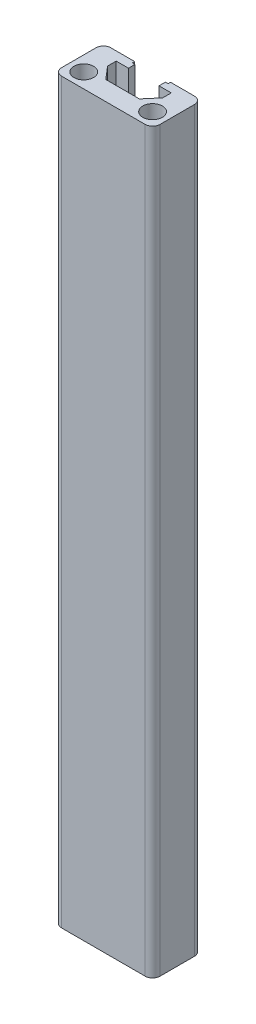
ISO-10303-21;
HEADER;
FILE_DESCRIPTION(('STEP AP214'),'2;1');
FILE_NAME('part.step','',(''),(''),'','','');
FILE_SCHEMA(('AUTOMOTIVE_DESIGN { 1 0 10303 214 1 1 1 1 }'));
ENDSEC;
DATA;
#1=APPLICATION_CONTEXT('core data for automotive mechanical design processes');
#2=APPLICATION_PROTOCOL_DEFINITION('international standard','automotive_design',2000,#1);
#3=PRODUCT_CONTEXT('',#1,'mechanical');
#4=PRODUCT('Part','Part','',(#3));
#5=PRODUCT_RELATED_PRODUCT_CATEGORY('part','',(#4));
#6=PRODUCT_DEFINITION_FORMATION('','',#4);
#7=PRODUCT_DEFINITION_CONTEXT('part definition',#1,'design');
#8=PRODUCT_DEFINITION('design','',#6,#7);
#9=PRODUCT_DEFINITION_SHAPE('','',#8);
#10=(LENGTH_UNIT() NAMED_UNIT(*) SI_UNIT(.MILLI.,.METRE.));
#11=(NAMED_UNIT(*) PLANE_ANGLE_UNIT() SI_UNIT($,.RADIAN.));
#12=(NAMED_UNIT(*) SI_UNIT($,.STERADIAN.) SOLID_ANGLE_UNIT());
#13=UNCERTAINTY_MEASURE_WITH_UNIT(LENGTH_MEASURE(1.E-05),#10,'distance_accuracy_value','');
#14=(GEOMETRIC_REPRESENTATION_CONTEXT(3) GLOBAL_UNCERTAINTY_ASSIGNED_CONTEXT((#13)) GLOBAL_UNIT_ASSIGNED_CONTEXT((#10,
#11,#12)) REPRESENTATION_CONTEXT('',''));
#15=CARTESIAN_POINT('',(0.,0.,0.));
#16=DIRECTION('',(0.,0.,1.));
#17=DIRECTION('',(1.,0.,0.));
#18=AXIS2_PLACEMENT_3D('',#15,#16,#17);
#19=CARTESIAN_POINT('',(0.,150.,0.));
#20=DIRECTION('',(0.,1.,0.));
#21=DIRECTION('',(0.,0.,1.));
#22=AXIS2_PLACEMENT_3D('',#19,#20,#21);
#23=PLANE('',#22);
#24=CARTESIAN_POINT('',(17.,150.,-3.));
#25=DIRECTION('',(0.,1.,0.));
#26=DIRECTION('',(0.,0.,1.));
#27=AXIS2_PLACEMENT_3D('',#24,#25,#26);
#28=CIRCLE('',#27,2.);
#29=CARTESIAN_POINT('',(17.,150.,-0.999999999999997));
#30=VERTEX_POINT('',#29);
#31=EDGE_CURVE('E242',#30,#30,#28,.T.);
#32=ORIENTED_EDGE('',*,*,#31,.F.);
#33=EDGE_LOOP('',(#32));
#34=FACE_BOUND('',#33,.T.);
#35=DIRECTION('',(-1.,0.,0.));
#36=VECTOR('',#35,1.);
#37=CARTESIAN_POINT('',(6.35,150.,-10.));
#38=LINE('',#37,#36);
#39=CARTESIAN_POINT('',(6.35,150.,-10.));
#40=VERTEX_POINT('',#39);
#41=CARTESIAN_POINT('',(1.5,150.,-10.));
#42=VERTEX_POINT('',#41);
#43=EDGE_CURVE('E235',#40,#42,#38,.T.);
#44=ORIENTED_EDGE('',*,*,#43,.T.);
#45=CARTESIAN_POINT('',(1.5,150.,-8.5));
#46=DIRECTION('',(0.,1.,0.));
#47=DIRECTION('',(0.,0.,1.));
#48=AXIS2_PLACEMENT_3D('',#45,#46,#47);
#49=CIRCLE('',#48,1.5);
#50=CARTESIAN_POINT('',(0.,150.,-8.5));
#51=VERTEX_POINT('',#50);
#52=EDGE_CURVE('E333',#42,#51,#49,.T.);
#53=ORIENTED_EDGE('',*,*,#52,.T.);
#54=DIRECTION('',(0.,0.,1.));
#55=VECTOR('',#54,1.);
#56=CARTESIAN_POINT('',(0.,150.,-10.));
#57=LINE('',#56,#55);
#58=CARTESIAN_POINT('',(0.,150.,-1.5));
#59=VERTEX_POINT('',#58);
#60=EDGE_CURVE('E277',#51,#59,#57,.T.);
#61=ORIENTED_EDGE('',*,*,#60,.T.);
#62=CARTESIAN_POINT('',(1.5,150.,-1.5));
#63=DIRECTION('',(0.,1.,0.));
#64=DIRECTION('',(0.,0.,1.));
#65=AXIS2_PLACEMENT_3D('',#62,#63,#64);
#66=CIRCLE('',#65,1.5);
#67=CARTESIAN_POINT('',(1.5,150.,0.));
#68=VERTEX_POINT('',#67);
#69=EDGE_CURVE('E331',#59,#68,#66,.T.);
#70=ORIENTED_EDGE('',*,*,#69,.T.);
#71=DIRECTION('',(1.,0.,0.));
#72=VECTOR('',#71,1.);
#73=CARTESIAN_POINT('',(0.,150.,0.));
#74=LINE('',#73,#72);
#75=CARTESIAN_POINT('',(18.5,150.,0.));
#76=VERTEX_POINT('',#75);
#77=EDGE_CURVE('E456',#68,#76,#74,.T.);
#78=ORIENTED_EDGE('',*,*,#77,.T.);
#79=CARTESIAN_POINT('',(18.5,150.,-1.5));
#80=DIRECTION('',(0.,1.,0.));
#81=DIRECTION('',(0.,0.,1.));
#82=AXIS2_PLACEMENT_3D('',#79,#80,#81);
#83=CIRCLE('',#82,1.5);
#84=CARTESIAN_POINT('',(20.,150.,-1.5));
#85=VERTEX_POINT('',#84);
#86=EDGE_CURVE('E328',#76,#85,#83,.T.);
#87=ORIENTED_EDGE('',*,*,#86,.T.);
#88=DIRECTION('',(0.,0.,-1.));
#89=VECTOR('',#88,1.);
#90=CARTESIAN_POINT('',(20.,150.,0.));
#91=LINE('',#90,#89);
#92=CARTESIAN_POINT('',(20.,150.,-8.5));
#93=VERTEX_POINT('',#92);
#94=EDGE_CURVE('E193',#85,#93,#91,.T.);
#95=ORIENTED_EDGE('',*,*,#94,.T.);
#96=CARTESIAN_POINT('',(18.5,150.,-8.5));
#97=DIRECTION('',(0.,1.,0.));
#98=DIRECTION('',(0.,0.,1.));
#99=AXIS2_PLACEMENT_3D('',#96,#97,#98);
#100=CIRCLE('',#99,1.5);
#101=CARTESIAN_POINT('',(18.5,150.,-10.));
#102=VERTEX_POINT('',#101);
#103=EDGE_CURVE('E52',#93,#102,#100,.T.);
#104=ORIENTED_EDGE('',*,*,#103,.T.);
#105=DIRECTION('',(-1.,0.,0.));
#106=VECTOR('',#105,1.);
#107=CARTESIAN_POINT('',(20.,150.,-10.));
#108=LINE('',#107,#106);
#109=CARTESIAN_POINT('',(13.65,150.,-10.));
#110=VERTEX_POINT('',#109);
#111=EDGE_CURVE('E183',#102,#110,#108,.T.);
#112=ORIENTED_EDGE('',*,*,#111,.T.);
#113=DIRECTION('',(0.,0.,1.));
#114=VECTOR('',#113,1.);
#115=CARTESIAN_POINT('',(13.65,150.,-9.51042760217637));
#116=LINE('',#115,#114);
#117=CARTESIAN_POINT('',(13.65,150.,-9.51042760217637));
#118=VERTEX_POINT('',#117);
#119=EDGE_CURVE('E188',#110,#118,#116,.T.);
#120=ORIENTED_EDGE('',*,*,#119,.T.);
#121=DIRECTION('',(-1.,0.,0.));
#122=VECTOR('',#121,1.);
#123=CARTESIAN_POINT('',(13.1,150.,-9.51042760217637));
#124=LINE('',#123,#122);
#125=CARTESIAN_POINT('',(13.1,150.,-9.51042760217637));
#126=VERTEX_POINT('',#125);
#127=EDGE_CURVE('E208',#118,#126,#124,.T.);
#128=ORIENTED_EDGE('',*,*,#127,.T.);
#129=DIRECTION('',(0.,0.,1.));
#130=VECTOR('',#129,1.);
#131=CARTESIAN_POINT('',(13.1,150.,-8.2));
#132=LINE('',#131,#130);
#133=CARTESIAN_POINT('',(13.1,150.,-8.2));
#134=VERTEX_POINT('',#133);
#135=EDGE_CURVE('E210',#126,#134,#132,.T.);
#136=ORIENTED_EDGE('',*,*,#135,.T.);
#137=DIRECTION('',(1.,0.,0.));
#138=VECTOR('',#137,1.);
#139=CARTESIAN_POINT('',(15.6,150.,-8.2));
#140=LINE('',#139,#138);
#141=CARTESIAN_POINT('',(15.6,150.,-8.2));
#142=VERTEX_POINT('',#141);
#143=EDGE_CURVE('E215',#134,#142,#140,.T.);
#144=ORIENTED_EDGE('',*,*,#143,.T.);
#145=DIRECTION('',(0.,0.,1.));
#146=VECTOR('',#145,1.);
#147=CARTESIAN_POINT('',(15.6,150.,-6.44750713590306));
#148=LINE('',#147,#146);
#149=CARTESIAN_POINT('',(15.6,150.,-6.44750713590306));
#150=VERTEX_POINT('',#149);
#151=EDGE_CURVE('E217',#142,#150,#148,.T.);
#152=ORIENTED_EDGE('',*,*,#151,.T.);
#153=DIRECTION('',(-0.651429062487269,0.,0.758709546893248));
#154=VECTOR('',#153,1.);
#155=CARTESIAN_POINT('',(13.4127068625717,150.,-3.9));
#156=LINE('',#155,#154);
#157=CARTESIAN_POINT('',(13.4127068625717,150.,-3.9));
#158=VERTEX_POINT('',#157);
#159=EDGE_CURVE('E219',#150,#158,#156,.T.);
#160=ORIENTED_EDGE('',*,*,#159,.T.);
#161=DIRECTION('',(-1.,0.,0.));
#162=VECTOR('',#161,1.);
#163=CARTESIAN_POINT('',(6.58729313742833,150.,-3.9));
#164=LINE('',#163,#162);
#165=CARTESIAN_POINT('',(6.58729313742833,150.,-3.9));
#166=VERTEX_POINT('',#165);
#167=EDGE_CURVE('E221',#158,#166,#164,.T.);
#168=ORIENTED_EDGE('',*,*,#167,.T.);
#169=DIRECTION('',(-0.651429062487269,0.,-0.758709546893248));
#170=VECTOR('',#169,1.);
#171=CARTESIAN_POINT('',(4.4,150.,-6.44750713590306));
#172=LINE('',#171,#170);
#173=CARTESIAN_POINT('',(4.4,150.,-6.44750713590306));
#174=VERTEX_POINT('',#173);
#175=EDGE_CURVE('E223',#166,#174,#172,.T.);
#176=ORIENTED_EDGE('',*,*,#175,.T.);
#177=DIRECTION('',(0.,0.,-1.));
#178=VECTOR('',#177,1.);
#179=CARTESIAN_POINT('',(4.4,150.,-8.2));
#180=LINE('',#179,#178);
#181=CARTESIAN_POINT('',(4.4,150.,-8.2));
#182=VERTEX_POINT('',#181);
#183=EDGE_CURVE('E225',#174,#182,#180,.T.);
#184=ORIENTED_EDGE('',*,*,#183,.T.);
#185=DIRECTION('',(1.,0.,0.));
#186=VECTOR('',#185,1.);
#187=CARTESIAN_POINT('',(6.9,150.,-8.2));
#188=LINE('',#187,#186);
#189=CARTESIAN_POINT('',(6.9,150.,-8.2));
#190=VERTEX_POINT('',#189);
#191=EDGE_CURVE('E227',#182,#190,#188,.T.);
#192=ORIENTED_EDGE('',*,*,#191,.T.);
#193=DIRECTION('',(0.,0.,-1.));
#194=VECTOR('',#193,1.);
#195=CARTESIAN_POINT('',(6.9,150.,-9.51042760217637));
#196=LINE('',#195,#194);
#197=CARTESIAN_POINT('',(6.9,150.,-9.51042760217637));
#198=VERTEX_POINT('',#197);
#199=EDGE_CURVE('E229',#190,#198,#196,.T.);
#200=ORIENTED_EDGE('',*,*,#199,.T.);
#201=DIRECTION('',(-1.,0.,0.));
#202=VECTOR('',#201,1.);
#203=CARTESIAN_POINT('',(6.35,150.,-9.51042760217637));
#204=LINE('',#203,#202);
#205=CARTESIAN_POINT('',(6.35,150.,-9.51042760217637));
#206=VERTEX_POINT('',#205);
#207=EDGE_CURVE('E231',#198,#206,#204,.T.);
#208=ORIENTED_EDGE('',*,*,#207,.T.);
#209=DIRECTION('',(0.,0.,-1.));
#210=VECTOR('',#209,1.);
#211=CARTESIAN_POINT('',(6.35,150.,-10.));
#212=LINE('',#211,#210);
#213=EDGE_CURVE('E233',#206,#40,#212,.T.);
#214=ORIENTED_EDGE('',*,*,#213,.T.);
#215=EDGE_LOOP('',(#44,#53,#61,#70,#78,#87,#95,#104,#112,#120,#128,#136,#144,#152,#160,#168,
#176,#184,#192,#200,#208,#214));
#216=FACE_BOUND('',#215,.T.);
#217=CARTESIAN_POINT('',(3.,150.,-3.));
#218=DIRECTION('',(0.,1.,0.));
#219=DIRECTION('',(0.,0.,1.));
#220=AXIS2_PLACEMENT_3D('',#217,#218,#219);
#221=CIRCLE('',#220,2.);
#222=CARTESIAN_POINT('',(3.,150.,-1.));
#223=VERTEX_POINT('',#222);
#224=EDGE_CURVE('E503',#223,#223,#221,.T.);
#225=ORIENTED_EDGE('',*,*,#224,.F.);
#226=EDGE_LOOP('',(#225));
#227=FACE_BOUND('',#226,.T.);
#228=ADVANCED_FACE('F37',(#34,#216,#227),#23,.T.);
#229=CARTESIAN_POINT('',(0.,0.,0.));
#230=DIRECTION('',(0.,1.,0.));
#231=DIRECTION('',(0.,0.,1.));
#232=AXIS2_PLACEMENT_3D('',#229,#230,#231);
#233=PLANE('',#232);
#234=DIRECTION('',(0.,0.,1.));
#235=VECTOR('',#234,1.);
#236=CARTESIAN_POINT('',(0.,0.,-10.));
#237=LINE('',#236,#235);
#238=CARTESIAN_POINT('',(0.,0.,-8.5));
#239=VERTEX_POINT('',#238);
#240=CARTESIAN_POINT('',(0.,0.,-1.5));
#241=VERTEX_POINT('',#240);
#242=EDGE_CURVE('E238',#239,#241,#237,.T.);
#243=ORIENTED_EDGE('',*,*,#242,.F.);
#244=CARTESIAN_POINT('',(1.5,0.,-8.5));
#245=DIRECTION('',(0.,1.,0.));
#246=DIRECTION('',(0.,0.,1.));
#247=AXIS2_PLACEMENT_3D('',#244,#245,#246);
#248=CIRCLE('',#247,1.5);
#249=CARTESIAN_POINT('',(1.5,0.,-10.));
#250=VERTEX_POINT('',#249);
#251=EDGE_CURVE('E324',#239,#250,#248,.F.);
#252=ORIENTED_EDGE('',*,*,#251,.T.);
#253=DIRECTION('',(-1.,0.,0.));
#254=VECTOR('',#253,1.);
#255=CARTESIAN_POINT('',(6.35,0.,-10.));
#256=LINE('',#255,#254);
#257=CARTESIAN_POINT('',(6.35,0.,-10.));
#258=VERTEX_POINT('',#257);
#259=EDGE_CURVE('E274',#258,#250,#256,.T.);
#260=ORIENTED_EDGE('',*,*,#259,.F.);
#261=DIRECTION('',(0.,0.,-1.));
#262=VECTOR('',#261,1.);
#263=CARTESIAN_POINT('',(6.35,0.,-10.));
#264=LINE('',#263,#262);
#265=CARTESIAN_POINT('',(6.35,0.,-9.51042760217637));
#266=VERTEX_POINT('',#265);
#267=EDGE_CURVE('E272',#266,#258,#264,.T.);
#268=ORIENTED_EDGE('',*,*,#267,.F.);
#269=DIRECTION('',(-1.,0.,0.));
#270=VECTOR('',#269,1.);
#271=CARTESIAN_POINT('',(6.35,0.,-9.51042760217637));
#272=LINE('',#271,#270);
#273=CARTESIAN_POINT('',(6.9,0.,-9.51042760217637));
#274=VERTEX_POINT('',#273);
#275=EDGE_CURVE('E270',#274,#266,#272,.T.);
#276=ORIENTED_EDGE('',*,*,#275,.F.);
#277=DIRECTION('',(0.,0.,-1.));
#278=VECTOR('',#277,1.);
#279=CARTESIAN_POINT('',(6.9,0.,-9.51042760217637));
#280=LINE('',#279,#278);
#281=CARTESIAN_POINT('',(6.9,0.,-8.2));
#282=VERTEX_POINT('',#281);
#283=EDGE_CURVE('E268',#282,#274,#280,.T.);
#284=ORIENTED_EDGE('',*,*,#283,.F.);
#285=DIRECTION('',(1.,0.,0.));
#286=VECTOR('',#285,1.);
#287=CARTESIAN_POINT('',(6.9,0.,-8.2));
#288=LINE('',#287,#286);
#289=CARTESIAN_POINT('',(4.4,0.,-8.2));
#290=VERTEX_POINT('',#289);
#291=EDGE_CURVE('E266',#290,#282,#288,.T.);
#292=ORIENTED_EDGE('',*,*,#291,.F.);
#293=DIRECTION('',(0.,0.,-1.));
#294=VECTOR('',#293,1.);
#295=CARTESIAN_POINT('',(4.4,0.,-8.2));
#296=LINE('',#295,#294);
#297=CARTESIAN_POINT('',(4.4,0.,-6.44750713590306));
#298=VERTEX_POINT('',#297);
#299=EDGE_CURVE('E264',#298,#290,#296,.T.);
#300=ORIENTED_EDGE('',*,*,#299,.F.);
#301=DIRECTION('',(-0.651429062487269,0.,-0.758709546893248));
#302=VECTOR('',#301,1.);
#303=CARTESIAN_POINT('',(4.4,0.,-6.44750713590306));
#304=LINE('',#303,#302);
#305=CARTESIAN_POINT('',(6.58729313742833,0.,-3.9));
#306=VERTEX_POINT('',#305);
#307=EDGE_CURVE('E262',#306,#298,#304,.T.);
#308=ORIENTED_EDGE('',*,*,#307,.F.);
#309=DIRECTION('',(-1.,0.,0.));
#310=VECTOR('',#309,1.);
#311=CARTESIAN_POINT('',(6.58729313742833,0.,-3.9));
#312=LINE('',#311,#310);
#313=CARTESIAN_POINT('',(13.4127068625717,0.,-3.9));
#314=VERTEX_POINT('',#313);
#315=EDGE_CURVE('E260',#314,#306,#312,.T.);
#316=ORIENTED_EDGE('',*,*,#315,.F.);
#317=DIRECTION('',(-0.651429062487269,0.,0.758709546893248));
#318=VECTOR('',#317,1.);
#319=CARTESIAN_POINT('',(13.4127068625717,0.,-3.9));
#320=LINE('',#319,#318);
#321=CARTESIAN_POINT('',(15.6,0.,-6.44750713590306));
#322=VERTEX_POINT('',#321);
#323=EDGE_CURVE('E258',#322,#314,#320,.T.);
#324=ORIENTED_EDGE('',*,*,#323,.F.);
#325=DIRECTION('',(0.,0.,1.));
#326=VECTOR('',#325,1.);
#327=CARTESIAN_POINT('',(15.6,0.,-6.44750713590306));
#328=LINE('',#327,#326);
#329=CARTESIAN_POINT('',(15.6,0.,-8.2));
#330=VERTEX_POINT('',#329);
#331=EDGE_CURVE('E256',#330,#322,#328,.T.);
#332=ORIENTED_EDGE('',*,*,#331,.F.);
#333=DIRECTION('',(1.,0.,0.));
#334=VECTOR('',#333,1.);
#335=CARTESIAN_POINT('',(15.6,0.,-8.2));
#336=LINE('',#335,#334);
#337=CARTESIAN_POINT('',(13.1,0.,-8.2));
#338=VERTEX_POINT('',#337);
#339=EDGE_CURVE('E254',#338,#330,#336,.T.);
#340=ORIENTED_EDGE('',*,*,#339,.F.);
#341=DIRECTION('',(0.,0.,1.));
#342=VECTOR('',#341,1.);
#343=CARTESIAN_POINT('',(13.1,0.,-8.2));
#344=LINE('',#343,#342);
#345=CARTESIAN_POINT('',(13.1,0.,-9.51042760217637));
#346=VERTEX_POINT('',#345);
#347=EDGE_CURVE('E252',#346,#338,#344,.T.);
#348=ORIENTED_EDGE('',*,*,#347,.F.);
#349=DIRECTION('',(-1.,0.,0.));
#350=VECTOR('',#349,1.);
#351=CARTESIAN_POINT('',(13.1,0.,-9.51042760217637));
#352=LINE('',#351,#350);
#353=CARTESIAN_POINT('',(13.65,0.,-9.51042760217637));
#354=VERTEX_POINT('',#353);
#355=EDGE_CURVE('E250',#354,#346,#352,.T.);
#356=ORIENTED_EDGE('',*,*,#355,.F.);
#357=DIRECTION('',(0.,0.,1.));
#358=VECTOR('',#357,1.);
#359=CARTESIAN_POINT('',(13.65,0.,-9.51042760217637));
#360=LINE('',#359,#358);
#361=CARTESIAN_POINT('',(13.65,0.,-10.));
#362=VERTEX_POINT('',#361);
#363=EDGE_CURVE('E248',#362,#354,#360,.T.);
#364=ORIENTED_EDGE('',*,*,#363,.F.);
#365=DIRECTION('',(-1.,0.,0.));
#366=VECTOR('',#365,1.);
#367=CARTESIAN_POINT('',(20.,0.,-10.));
#368=LINE('',#367,#366);
#369=CARTESIAN_POINT('',(18.5,0.,-10.));
#370=VERTEX_POINT('',#369);
#371=EDGE_CURVE('E199',#370,#362,#368,.T.);
#372=ORIENTED_EDGE('',*,*,#371,.F.);
#373=CARTESIAN_POINT('',(18.5,0.,-8.5));
#374=DIRECTION('',(0.,1.,0.));
#375=DIRECTION('',(0.,0.,1.));
#376=AXIS2_PLACEMENT_3D('',#373,#374,#375);
#377=CIRCLE('',#376,1.5);
#378=CARTESIAN_POINT('',(20.,0.,-8.5));
#379=VERTEX_POINT('',#378);
#380=EDGE_CURVE('E320',#370,#379,#377,.F.);
#381=ORIENTED_EDGE('',*,*,#380,.T.);
#382=DIRECTION('',(0.,0.,-1.));
#383=VECTOR('',#382,1.);
#384=CARTESIAN_POINT('',(20.,0.,0.));
#385=LINE('',#384,#383);
#386=CARTESIAN_POINT('',(20.,0.,-1.5));
#387=VERTEX_POINT('',#386);
#388=EDGE_CURVE('E245',#387,#379,#385,.T.);
#389=ORIENTED_EDGE('',*,*,#388,.F.);
#390=CARTESIAN_POINT('',(18.5,0.,-1.5));
#391=DIRECTION('',(0.,1.,0.));
#392=DIRECTION('',(0.,0.,1.));
#393=AXIS2_PLACEMENT_3D('',#390,#391,#392);
#394=CIRCLE('',#393,1.5);
#395=CARTESIAN_POINT('',(18.5,0.,0.));
#396=VERTEX_POINT('',#395);
#397=EDGE_CURVE('E318',#387,#396,#394,.F.);
#398=ORIENTED_EDGE('',*,*,#397,.T.);
#399=DIRECTION('',(1.,0.,0.));
#400=VECTOR('',#399,1.);
#401=CARTESIAN_POINT('',(0.,0.,0.));
#402=LINE('',#401,#400);
#403=CARTESIAN_POINT('',(1.5,0.,0.));
#404=VERTEX_POINT('',#403);
#405=EDGE_CURVE('E241',#404,#396,#402,.T.);
#406=ORIENTED_EDGE('',*,*,#405,.F.);
#407=CARTESIAN_POINT('',(1.5,0.,-1.5));
#408=DIRECTION('',(0.,1.,0.));
#409=DIRECTION('',(0.,0.,1.));
#410=AXIS2_PLACEMENT_3D('',#407,#408,#409);
#411=CIRCLE('',#410,1.5);
#412=EDGE_CURVE('E322',#404,#241,#411,.F.);
#413=ORIENTED_EDGE('',*,*,#412,.T.);
#414=EDGE_LOOP('',(#243,#252,#260,#268,#276,#284,#292,#300,#308,#316,#324,#332,#340,#348,#356,
#364,#372,#381,#389,#398,#406,#413));
#415=FACE_BOUND('',#414,.T.);
#416=CARTESIAN_POINT('',(17.,0.,-3.));
#417=DIRECTION('',(0.,1.,0.));
#418=DIRECTION('',(0.,0.,1.));
#419=AXIS2_PLACEMENT_3D('',#416,#417,#418);
#420=CIRCLE('',#419,2.);
#421=CARTESIAN_POINT('',(17.,0.,-0.999999999999997));
#422=VERTEX_POINT('',#421);
#423=EDGE_CURVE('E461',#422,#422,#420,.T.);
#424=ORIENTED_EDGE('',*,*,#423,.T.);
#425=EDGE_LOOP('',(#424));
#426=FACE_BOUND('',#425,.T.);
#427=CARTESIAN_POINT('',(3.,0.,-3.));
#428=DIRECTION('',(0.,1.,0.));
#429=DIRECTION('',(0.,0.,1.));
#430=AXIS2_PLACEMENT_3D('',#427,#428,#429);
#431=CIRCLE('',#430,2.);
#432=CARTESIAN_POINT('',(3.,0.,-1.));
#433=VERTEX_POINT('',#432);
#434=EDGE_CURVE('E506',#433,#433,#431,.T.);
#435=ORIENTED_EDGE('',*,*,#434,.T.);
#436=EDGE_LOOP('',(#435));
#437=FACE_BOUND('',#436,.T.);
#438=ADVANCED_FACE('F349',(#415,#426,#437),#233,.F.);
#439=CARTESIAN_POINT('',(0.,150.,-10.));
#440=DIRECTION('',(1.,0.,0.));
#441=DIRECTION('',(0.,0.,-1.));
#442=AXIS2_PLACEMENT_3D('',#439,#440,#441);
#443=PLANE('',#442);
#444=ORIENTED_EDGE('',*,*,#60,.F.);
#445=DIRECTION('',(0.,-1.,0.));
#446=VECTOR('',#445,1.);
#447=CARTESIAN_POINT('',(0.,150.,-8.5));
#448=LINE('',#447,#446);
#449=EDGE_CURVE('E315',#51,#239,#448,.T.);
#450=ORIENTED_EDGE('',*,*,#449,.T.);
#451=ORIENTED_EDGE('',*,*,#242,.T.);
#452=DIRECTION('',(0.,-1.,0.));
#453=VECTOR('',#452,1.);
#454=CARTESIAN_POINT('',(0.,150.,-1.5));
#455=LINE('',#454,#453);
#456=EDGE_CURVE('E202',#241,#59,#455,.F.);
#457=ORIENTED_EDGE('',*,*,#456,.T.);
#458=EDGE_LOOP('',(#444,#450,#451,#457));
#459=FACE_BOUND('',#458,.T.);
#460=ADVANCED_FACE('F369',(#459),#443,.F.);
#461=CARTESIAN_POINT('',(0.,150.,0.));
#462=DIRECTION('',(0.,0.,-1.));
#463=DIRECTION('',(-1.,0.,0.));
#464=AXIS2_PLACEMENT_3D('',#461,#462,#463);
#465=PLANE('',#464);
#466=ORIENTED_EDGE('',*,*,#77,.F.);
#467=DIRECTION('',(0.,-1.,0.));
#468=VECTOR('',#467,1.);
#469=CARTESIAN_POINT('',(1.5,150.,0.));
#470=LINE('',#469,#468);
#471=EDGE_CURVE('E337',#68,#404,#470,.T.);
#472=ORIENTED_EDGE('',*,*,#471,.T.);
#473=ORIENTED_EDGE('',*,*,#405,.T.);
#474=DIRECTION('',(0.,-1.,0.));
#475=VECTOR('',#474,1.);
#476=CARTESIAN_POINT('',(18.5,150.,0.));
#477=LINE('',#476,#475);
#478=EDGE_CURVE('E335',#396,#76,#477,.F.);
#479=ORIENTED_EDGE('',*,*,#478,.T.);
#480=EDGE_LOOP('',(#466,#472,#473,#479));
#481=FACE_BOUND('',#480,.T.);
#482=ADVANCED_FACE('F434',(#481),#465,.F.);
#483=CARTESIAN_POINT('',(20.,150.,0.));
#484=DIRECTION('',(-1.,0.,0.));
#485=DIRECTION('',(0.,0.,1.));
#486=AXIS2_PLACEMENT_3D('',#483,#484,#485);
#487=PLANE('',#486);
#488=ORIENTED_EDGE('',*,*,#388,.T.);
#489=DIRECTION('',(0.,-1.,0.));
#490=VECTOR('',#489,1.);
#491=CARTESIAN_POINT('',(20.,150.,-8.5));
#492=LINE('',#491,#490);
#493=EDGE_CURVE('E11',#379,#93,#492,.F.);
#494=ORIENTED_EDGE('',*,*,#493,.T.);
#495=ORIENTED_EDGE('',*,*,#94,.F.);
#496=DIRECTION('',(0.,-1.,0.));
#497=VECTOR('',#496,1.);
#498=CARTESIAN_POINT('',(20.,150.,-1.5));
#499=LINE('',#498,#497);
#500=EDGE_CURVE('E45',#85,#387,#499,.T.);
#501=ORIENTED_EDGE('',*,*,#500,.T.);
#502=EDGE_LOOP('',(#488,#494,#495,#501));
#503=FACE_BOUND('',#502,.T.);
#504=ADVANCED_FACE('F344',(#503),#487,.F.);
#505=CARTESIAN_POINT('',(20.,150.,-10.));
#506=DIRECTION('',(0.,0.,1.));
#507=DIRECTION('',(1.,0.,0.));
#508=AXIS2_PLACEMENT_3D('',#505,#506,#507);
#509=PLANE('',#508);
#510=ORIENTED_EDGE('',*,*,#111,.F.);
#511=DIRECTION('',(0.,-1.,0.));
#512=VECTOR('',#511,1.);
#513=CARTESIAN_POINT('',(18.5,150.,-10.));
#514=LINE('',#513,#512);
#515=EDGE_CURVE('E340',#102,#370,#514,.T.);
#516=ORIENTED_EDGE('',*,*,#515,.T.);
#517=ORIENTED_EDGE('',*,*,#371,.T.);
#518=DIRECTION('',(0.,-1.,0.));
#519=VECTOR('',#518,1.);
#520=CARTESIAN_POINT('',(13.65,150.,-10.));
#521=LINE('',#520,#519);
#522=EDGE_CURVE('E196',#110,#362,#521,.T.);
#523=ORIENTED_EDGE('',*,*,#522,.F.);
#524=EDGE_LOOP('',(#510,#516,#517,#523));
#525=FACE_BOUND('',#524,.T.);
#526=ADVANCED_FACE('F197',(#525),#509,.F.);
#527=CARTESIAN_POINT('',(13.65,150.,-9.51042760217637));
#528=DIRECTION('',(1.,0.,0.));
#529=DIRECTION('',(0.,0.,-1.));
#530=AXIS2_PLACEMENT_3D('',#527,#528,#529);
#531=PLANE('',#530);
#532=ORIENTED_EDGE('',*,*,#363,.T.);
#533=DIRECTION('',(0.,-1.,0.));
#534=VECTOR('',#533,1.);
#535=CARTESIAN_POINT('',(13.65,150.,-9.51042760217637));
#536=LINE('',#535,#534);
#537=EDGE_CURVE('E203',#118,#354,#536,.T.);
#538=ORIENTED_EDGE('',*,*,#537,.F.);
#539=ORIENTED_EDGE('',*,*,#119,.F.);
#540=ORIENTED_EDGE('',*,*,#522,.T.);
#541=EDGE_LOOP('',(#532,#538,#539,#540));
#542=FACE_BOUND('',#541,.T.);
#543=ADVANCED_FACE('F205',(#542),#531,.F.);
#544=CARTESIAN_POINT('',(13.1,150.,-9.51042760217637));
#545=DIRECTION('',(0.,0.,1.));
#546=DIRECTION('',(1.,0.,0.));
#547=AXIS2_PLACEMENT_3D('',#544,#545,#546);
#548=PLANE('',#547);
#549=ORIENTED_EDGE('',*,*,#355,.T.);
#550=DIRECTION('',(0.,-1.,0.));
#551=VECTOR('',#550,1.);
#552=CARTESIAN_POINT('',(13.1,150.,-9.51042760217637));
#553=LINE('',#552,#551);
#554=EDGE_CURVE('E310',#126,#346,#553,.T.);
#555=ORIENTED_EDGE('',*,*,#554,.F.);
#556=ORIENTED_EDGE('',*,*,#127,.F.);
#557=ORIENTED_EDGE('',*,*,#537,.T.);
#558=EDGE_LOOP('',(#549,#555,#556,#557));
#559=FACE_BOUND('',#558,.T.);
#560=ADVANCED_FACE('F423',(#559),#548,.F.);
#561=CARTESIAN_POINT('',(13.1,150.,-8.2));
#562=DIRECTION('',(1.,0.,0.));
#563=DIRECTION('',(0.,0.,-1.));
#564=AXIS2_PLACEMENT_3D('',#561,#562,#563);
#565=PLANE('',#564);
#566=ORIENTED_EDGE('',*,*,#347,.T.);
#567=DIRECTION('',(0.,-1.,0.));
#568=VECTOR('',#567,1.);
#569=CARTESIAN_POINT('',(13.1,150.,-8.2));
#570=LINE('',#569,#568);
#571=EDGE_CURVE('E307',#134,#338,#570,.T.);
#572=ORIENTED_EDGE('',*,*,#571,.F.);
#573=ORIENTED_EDGE('',*,*,#135,.F.);
#574=ORIENTED_EDGE('',*,*,#554,.T.);
#575=EDGE_LOOP('',(#566,#572,#573,#574));
#576=FACE_BOUND('',#575,.T.);
#577=ADVANCED_FACE('F419',(#576),#565,.F.);
#578=CARTESIAN_POINT('',(15.6,150.,-8.2));
#579=DIRECTION('',(0.,0.,-1.));
#580=DIRECTION('',(-1.,0.,0.));
#581=AXIS2_PLACEMENT_3D('',#578,#579,#580);
#582=PLANE('',#581);
#583=ORIENTED_EDGE('',*,*,#339,.T.);
#584=DIRECTION('',(0.,-1.,0.));
#585=VECTOR('',#584,1.);
#586=CARTESIAN_POINT('',(15.6,150.,-8.2));
#587=LINE('',#586,#585);
#588=EDGE_CURVE('E304',#142,#330,#587,.T.);
#589=ORIENTED_EDGE('',*,*,#588,.F.);
#590=ORIENTED_EDGE('',*,*,#143,.F.);
#591=ORIENTED_EDGE('',*,*,#571,.T.);
#592=EDGE_LOOP('',(#583,#589,#590,#591));
#593=FACE_BOUND('',#592,.T.);
#594=ADVANCED_FACE('F415',(#593),#582,.F.);
#595=CARTESIAN_POINT('',(15.6,150.,-6.44750713590306));
#596=DIRECTION('',(1.,0.,0.));
#597=DIRECTION('',(0.,0.,-1.));
#598=AXIS2_PLACEMENT_3D('',#595,#596,#597);
#599=PLANE('',#598);
#600=ORIENTED_EDGE('',*,*,#331,.T.);
#601=DIRECTION('',(0.,-1.,0.));
#602=VECTOR('',#601,1.);
#603=CARTESIAN_POINT('',(15.6,150.,-6.44750713590306));
#604=LINE('',#603,#602);
#605=EDGE_CURVE('E301',#150,#322,#604,.T.);
#606=ORIENTED_EDGE('',*,*,#605,.F.);
#607=ORIENTED_EDGE('',*,*,#151,.F.);
#608=ORIENTED_EDGE('',*,*,#588,.T.);
#609=EDGE_LOOP('',(#600,#606,#607,#608));
#610=FACE_BOUND('',#609,.T.);
#611=ADVANCED_FACE('F411',(#610),#599,.F.);
#612=CARTESIAN_POINT('',(13.4127068625717,150.,-3.9));
#613=DIRECTION('',(0.758709546893248,0.,0.651429062487269));
#614=DIRECTION('',(0.651429062487269,0.,-0.758709546893248));
#615=AXIS2_PLACEMENT_3D('',#612,#613,#614);
#616=PLANE('',#615);
#617=ORIENTED_EDGE('',*,*,#323,.T.);
#618=DIRECTION('',(0.,-1.,0.));
#619=VECTOR('',#618,1.);
#620=CARTESIAN_POINT('',(13.4127068625717,150.,-3.9));
#621=LINE('',#620,#619);
#622=EDGE_CURVE('E298',#158,#314,#621,.T.);
#623=ORIENTED_EDGE('',*,*,#622,.F.);
#624=ORIENTED_EDGE('',*,*,#159,.F.);
#625=ORIENTED_EDGE('',*,*,#605,.T.);
#626=EDGE_LOOP('',(#617,#623,#624,#625));
#627=FACE_BOUND('',#626,.T.);
#628=ADVANCED_FACE('F407',(#627),#616,.F.);
#629=CARTESIAN_POINT('',(6.58729313742833,150.,-3.9));
#630=DIRECTION('',(0.,0.,1.));
#631=DIRECTION('',(1.,0.,0.));
#632=AXIS2_PLACEMENT_3D('',#629,#630,#631);
#633=PLANE('',#632);
#634=ORIENTED_EDGE('',*,*,#315,.T.);
#635=DIRECTION('',(0.,-1.,0.));
#636=VECTOR('',#635,1.);
#637=CARTESIAN_POINT('',(6.58729313742833,150.,-3.9));
#638=LINE('',#637,#636);
#639=EDGE_CURVE('E295',#166,#306,#638,.T.);
#640=ORIENTED_EDGE('',*,*,#639,.F.);
#641=ORIENTED_EDGE('',*,*,#167,.F.);
#642=ORIENTED_EDGE('',*,*,#622,.T.);
#643=EDGE_LOOP('',(#634,#640,#641,#642));
#644=FACE_BOUND('',#643,.T.);
#645=ADVANCED_FACE('F403',(#644),#633,.F.);
#646=CARTESIAN_POINT('',(4.4,150.,-6.44750713590306));
#647=DIRECTION('',(-0.758709546893248,0.,0.651429062487269));
#648=DIRECTION('',(0.651429062487269,0.,0.758709546893248));
#649=AXIS2_PLACEMENT_3D('',#646,#647,#648);
#650=PLANE('',#649);
#651=ORIENTED_EDGE('',*,*,#307,.T.);
#652=DIRECTION('',(0.,-1.,0.));
#653=VECTOR('',#652,1.);
#654=CARTESIAN_POINT('',(4.4,150.,-6.44750713590306));
#655=LINE('',#654,#653);
#656=EDGE_CURVE('E292',#174,#298,#655,.T.);
#657=ORIENTED_EDGE('',*,*,#656,.F.);
#658=ORIENTED_EDGE('',*,*,#175,.F.);
#659=ORIENTED_EDGE('',*,*,#639,.T.);
#660=EDGE_LOOP('',(#651,#657,#658,#659));
#661=FACE_BOUND('',#660,.T.);
#662=ADVANCED_FACE('F399',(#661),#650,.F.);
#663=CARTESIAN_POINT('',(4.4,150.,-8.2));
#664=DIRECTION('',(-1.,0.,0.));
#665=DIRECTION('',(0.,0.,1.));
#666=AXIS2_PLACEMENT_3D('',#663,#664,#665);
#667=PLANE('',#666);
#668=ORIENTED_EDGE('',*,*,#299,.T.);
#669=DIRECTION('',(0.,-1.,0.));
#670=VECTOR('',#669,1.);
#671=CARTESIAN_POINT('',(4.4,150.,-8.2));
#672=LINE('',#671,#670);
#673=EDGE_CURVE('E289',#182,#290,#672,.T.);
#674=ORIENTED_EDGE('',*,*,#673,.F.);
#675=ORIENTED_EDGE('',*,*,#183,.F.);
#676=ORIENTED_EDGE('',*,*,#656,.T.);
#677=EDGE_LOOP('',(#668,#674,#675,#676));
#678=FACE_BOUND('',#677,.T.);
#679=ADVANCED_FACE('F395',(#678),#667,.F.);
#680=CARTESIAN_POINT('',(6.9,150.,-8.2));
#681=DIRECTION('',(0.,0.,-1.));
#682=DIRECTION('',(-1.,0.,0.));
#683=AXIS2_PLACEMENT_3D('',#680,#681,#682);
#684=PLANE('',#683);
#685=ORIENTED_EDGE('',*,*,#291,.T.);
#686=DIRECTION('',(0.,-1.,0.));
#687=VECTOR('',#686,1.);
#688=CARTESIAN_POINT('',(6.9,150.,-8.2));
#689=LINE('',#688,#687);
#690=EDGE_CURVE('E286',#190,#282,#689,.T.);
#691=ORIENTED_EDGE('',*,*,#690,.F.);
#692=ORIENTED_EDGE('',*,*,#191,.F.);
#693=ORIENTED_EDGE('',*,*,#673,.T.);
#694=EDGE_LOOP('',(#685,#691,#692,#693));
#695=FACE_BOUND('',#694,.T.);
#696=ADVANCED_FACE('F391',(#695),#684,.F.);
#697=CARTESIAN_POINT('',(6.9,150.,-9.51042760217637));
#698=DIRECTION('',(-1.,0.,0.));
#699=DIRECTION('',(0.,0.,1.));
#700=AXIS2_PLACEMENT_3D('',#697,#698,#699);
#701=PLANE('',#700);
#702=ORIENTED_EDGE('',*,*,#283,.T.);
#703=DIRECTION('',(0.,-1.,0.));
#704=VECTOR('',#703,1.);
#705=CARTESIAN_POINT('',(6.9,150.,-9.51042760217637));
#706=LINE('',#705,#704);
#707=EDGE_CURVE('E283',#198,#274,#706,.T.);
#708=ORIENTED_EDGE('',*,*,#707,.F.);
#709=ORIENTED_EDGE('',*,*,#199,.F.);
#710=ORIENTED_EDGE('',*,*,#690,.T.);
#711=EDGE_LOOP('',(#702,#708,#709,#710));
#712=FACE_BOUND('',#711,.T.);
#713=ADVANCED_FACE('F387',(#712),#701,.F.);
#714=CARTESIAN_POINT('',(6.35,150.,-9.51042760217637));
#715=DIRECTION('',(0.,0.,1.));
#716=DIRECTION('',(1.,0.,0.));
#717=AXIS2_PLACEMENT_3D('',#714,#715,#716);
#718=PLANE('',#717);
#719=ORIENTED_EDGE('',*,*,#275,.T.);
#720=DIRECTION('',(0.,-1.,0.));
#721=VECTOR('',#720,1.);
#722=CARTESIAN_POINT('',(6.35,150.,-9.51042760217637));
#723=LINE('',#722,#721);
#724=EDGE_CURVE('E280',#206,#266,#723,.T.);
#725=ORIENTED_EDGE('',*,*,#724,.F.);
#726=ORIENTED_EDGE('',*,*,#207,.F.);
#727=ORIENTED_EDGE('',*,*,#707,.T.);
#728=EDGE_LOOP('',(#719,#725,#726,#727));
#729=FACE_BOUND('',#728,.T.);
#730=ADVANCED_FACE('F383',(#729),#718,.F.);
#731=CARTESIAN_POINT('',(6.35,150.,-10.));
#732=DIRECTION('',(-1.,0.,0.));
#733=DIRECTION('',(0.,0.,1.));
#734=AXIS2_PLACEMENT_3D('',#731,#732,#733);
#735=PLANE('',#734);
#736=ORIENTED_EDGE('',*,*,#267,.T.);
#737=DIRECTION('',(0.,-1.,0.));
#738=VECTOR('',#737,1.);
#739=CARTESIAN_POINT('',(6.35,150.,-10.));
#740=LINE('',#739,#738);
#741=EDGE_CURVE('E237',#40,#258,#740,.T.);
#742=ORIENTED_EDGE('',*,*,#741,.F.);
#743=ORIENTED_EDGE('',*,*,#213,.F.);
#744=ORIENTED_EDGE('',*,*,#724,.T.);
#745=EDGE_LOOP('',(#736,#742,#743,#744));
#746=FACE_BOUND('',#745,.T.);
#747=ADVANCED_FACE('F379',(#746),#735,.F.);
#748=CARTESIAN_POINT('',(6.35,150.,-10.));
#749=DIRECTION('',(0.,0.,1.));
#750=DIRECTION('',(1.,0.,0.));
#751=AXIS2_PLACEMENT_3D('',#748,#749,#750);
#752=PLANE('',#751);
#753=ORIENTED_EDGE('',*,*,#259,.T.);
#754=DIRECTION('',(0.,-1.,0.));
#755=VECTOR('',#754,1.);
#756=CARTESIAN_POINT('',(1.5,150.,-10.));
#757=LINE('',#756,#755);
#758=EDGE_CURVE('E326',#250,#42,#757,.F.);
#759=ORIENTED_EDGE('',*,*,#758,.T.);
#760=ORIENTED_EDGE('',*,*,#43,.F.);
#761=ORIENTED_EDGE('',*,*,#741,.T.);
#762=EDGE_LOOP('',(#753,#759,#760,#761));
#763=FACE_BOUND('',#762,.T.);
#764=ADVANCED_FACE('F376',(#763),#752,.F.);
#765=CARTESIAN_POINT('',(17.,150.,-3.));
#766=DIRECTION('',(0.,-1.,0.));
#767=DIRECTION('',(0.,0.,-1.));
#768=AXIS2_PLACEMENT_3D('',#765,#766,#767);
#769=CYLINDRICAL_SURFACE('',#768,2.);
#770=ORIENTED_EDGE('',*,*,#31,.T.);
#771=EDGE_LOOP('',(#770));
#772=FACE_BOUND('',#771,.T.);
#773=ORIENTED_EDGE('',*,*,#423,.F.);
#774=EDGE_LOOP('',(#773));
#775=FACE_BOUND('',#774,.T.);
#776=ADVANCED_FACE('F373',(#772,#775),#769,.F.);
#777=CARTESIAN_POINT('',(3.,150.,-3.));
#778=DIRECTION('',(0.,-1.,0.));
#779=DIRECTION('',(0.,0.,-1.));
#780=AXIS2_PLACEMENT_3D('',#777,#778,#779);
#781=CYLINDRICAL_SURFACE('',#780,2.);
#782=ORIENTED_EDGE('',*,*,#224,.T.);
#783=EDGE_LOOP('',(#782));
#784=FACE_BOUND('',#783,.T.);
#785=ORIENTED_EDGE('',*,*,#434,.F.);
#786=EDGE_LOOP('',(#785));
#787=FACE_BOUND('',#786,.T.);
#788=ADVANCED_FACE('F442',(#784,#787),#781,.F.);
#789=CARTESIAN_POINT('',(1.5,150.,-8.5));
#790=DIRECTION('',(0.,-1.,0.));
#791=DIRECTION('',(0.,0.,-1.));
#792=AXIS2_PLACEMENT_3D('',#789,#790,#791);
#793=CYLINDRICAL_SURFACE('',#792,1.5);
#794=ORIENTED_EDGE('',*,*,#52,.F.);
#795=ORIENTED_EDGE('',*,*,#758,.F.);
#796=ORIENTED_EDGE('',*,*,#251,.F.);
#797=ORIENTED_EDGE('',*,*,#449,.F.);
#798=EDGE_LOOP('',(#794,#795,#796,#797));
#799=FACE_BOUND('',#798,.T.);
#800=ADVANCED_FACE('F360',(#799),#793,.T.);
#801=CARTESIAN_POINT('',(1.5,150.,-1.5));
#802=DIRECTION('',(0.,-1.,0.));
#803=DIRECTION('',(0.,0.,-1.));
#804=AXIS2_PLACEMENT_3D('',#801,#802,#803);
#805=CYLINDRICAL_SURFACE('',#804,1.5);
#806=ORIENTED_EDGE('',*,*,#69,.F.);
#807=ORIENTED_EDGE('',*,*,#456,.F.);
#808=ORIENTED_EDGE('',*,*,#412,.F.);
#809=ORIENTED_EDGE('',*,*,#471,.F.);
#810=EDGE_LOOP('',(#806,#807,#808,#809));
#811=FACE_BOUND('',#810,.T.);
#812=ADVANCED_FACE('F355',(#811),#805,.T.);
#813=CARTESIAN_POINT('',(18.5,150.,-8.5));
#814=DIRECTION('',(0.,-1.,0.));
#815=DIRECTION('',(0.,0.,-1.));
#816=AXIS2_PLACEMENT_3D('',#813,#814,#815);
#817=CYLINDRICAL_SURFACE('',#816,1.5);
#818=ORIENTED_EDGE('',*,*,#103,.F.);
#819=ORIENTED_EDGE('',*,*,#493,.F.);
#820=ORIENTED_EDGE('',*,*,#380,.F.);
#821=ORIENTED_EDGE('',*,*,#515,.F.);
#822=EDGE_LOOP('',(#818,#819,#820,#821));
#823=FACE_BOUND('',#822,.T.);
#824=ADVANCED_FACE('F353',(#823),#817,.T.);
#825=CARTESIAN_POINT('',(18.5,150.,-1.5));
#826=DIRECTION('',(0.,-1.,0.));
#827=DIRECTION('',(0.,0.,-1.));
#828=AXIS2_PLACEMENT_3D('',#825,#826,#827);
#829=CYLINDRICAL_SURFACE('',#828,1.5);
#830=ORIENTED_EDGE('',*,*,#86,.F.);
#831=ORIENTED_EDGE('',*,*,#478,.F.);
#832=ORIENTED_EDGE('',*,*,#397,.F.);
#833=ORIENTED_EDGE('',*,*,#500,.F.);
#834=EDGE_LOOP('',(#830,#831,#832,#833));
#835=FACE_BOUND('',#834,.T.);
#836=ADVANCED_FACE('F39',(#835),#829,.T.);
#837=CLOSED_SHELL('',(#228,#438,#460,#482,#504,#526,#543,#560,#577,#594,#611,#628,#645,#662,
#679,#696,#713,#730,#747,#764,#776,#788,#800,#812,#824,#836));
#838=MANIFOLD_SOLID_BREP('B2',#837);
#839=ADVANCED_BREP_SHAPE_REPRESENTATION('',(#18,#838),#14);
#840=SHAPE_DEFINITION_REPRESENTATION(#9,#839);
ENDSEC;
END-ISO-10303-21;
